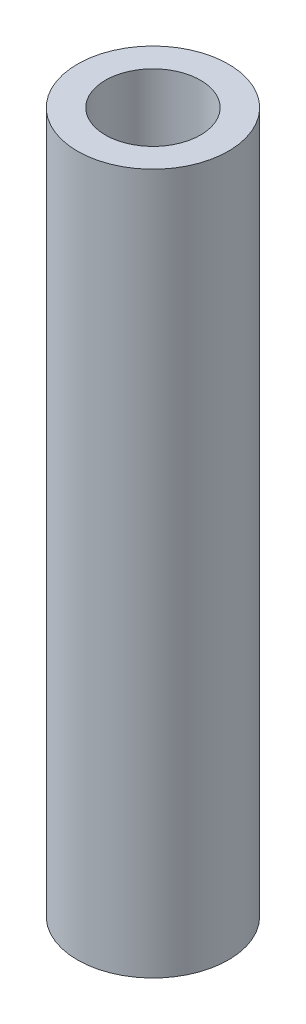
ISO-10303-21;
HEADER;
FILE_DESCRIPTION(('STEP AP214'),'2;1');
FILE_NAME('part.step','',(''),(''),'','','');
FILE_SCHEMA(('AUTOMOTIVE_DESIGN { 1 0 10303 214 1 1 1 1 }'));
ENDSEC;
DATA;
#1=APPLICATION_CONTEXT('core data for automotive mechanical design processes');
#2=APPLICATION_PROTOCOL_DEFINITION('international standard','automotive_design',2000,#1);
#3=PRODUCT_CONTEXT('',#1,'mechanical');
#4=PRODUCT('Part','Part','',(#3));
#5=PRODUCT_RELATED_PRODUCT_CATEGORY('part','',(#4));
#6=PRODUCT_DEFINITION_FORMATION('','',#4);
#7=PRODUCT_DEFINITION_CONTEXT('part definition',#1,'design');
#8=PRODUCT_DEFINITION('design','',#6,#7);
#9=PRODUCT_DEFINITION_SHAPE('','',#8);
#10=(LENGTH_UNIT() NAMED_UNIT(*) SI_UNIT(.MILLI.,.METRE.));
#11=(NAMED_UNIT(*) PLANE_ANGLE_UNIT() SI_UNIT($,.RADIAN.));
#12=(NAMED_UNIT(*) SI_UNIT($,.STERADIAN.) SOLID_ANGLE_UNIT());
#13=UNCERTAINTY_MEASURE_WITH_UNIT(LENGTH_MEASURE(1.E-05),#10,'distance_accuracy_value','');
#14=(GEOMETRIC_REPRESENTATION_CONTEXT(3) GLOBAL_UNCERTAINTY_ASSIGNED_CONTEXT((#13)) GLOBAL_UNIT_ASSIGNED_CONTEXT((#10,
#11,#12)) REPRESENTATION_CONTEXT('',''));
#15=CARTESIAN_POINT('',(0.,0.,0.));
#16=DIRECTION('',(0.,0.,1.));
#17=DIRECTION('',(1.,0.,0.));
#18=AXIS2_PLACEMENT_3D('',#15,#16,#17);
#19=CARTESIAN_POINT('',(0.,-29.464,0.));
#20=DIRECTION('',(0.,1.,0.));
#21=DIRECTION('',(0.,0.,1.));
#22=AXIS2_PLACEMENT_3D('',#19,#20,#21);
#23=CYLINDRICAL_SURFACE('',#22,3.175);
#24=CARTESIAN_POINT('',(0.,-29.464,0.));
#25=DIRECTION('',(0.,1.,0.));
#26=DIRECTION('',(0.,0.,1.));
#27=AXIS2_PLACEMENT_3D('',#24,#25,#26);
#28=CIRCLE('',#27,3.175);
#29=CARTESIAN_POINT('',(0.,-29.464,3.175));
#30=VERTEX_POINT('',#29);
#31=EDGE_CURVE('E10',#30,#30,#28,.T.);
#32=ORIENTED_EDGE('',*,*,#31,.T.);
#33=EDGE_LOOP('',(#32));
#34=FACE_BOUND('',#33,.T.);
#35=CARTESIAN_POINT('',(0.,0.,0.));
#36=DIRECTION('',(0.,1.,0.));
#37=DIRECTION('',(0.,0.,1.));
#38=AXIS2_PLACEMENT_3D('',#35,#36,#37);
#39=CIRCLE('',#38,3.175);
#40=CARTESIAN_POINT('',(0.,0.,3.175));
#41=VERTEX_POINT('',#40);
#42=EDGE_CURVE('E42',#41,#41,#39,.T.);
#43=ORIENTED_EDGE('',*,*,#42,.F.);
#44=EDGE_LOOP('',(#43));
#45=FACE_BOUND('',#44,.T.);
#46=ADVANCED_FACE('F39',(#34,#45),#23,.T.);
#47=CARTESIAN_POINT('',(0.,-29.464,0.));
#48=DIRECTION('',(0.,1.,0.));
#49=DIRECTION('',(0.,0.,1.));
#50=AXIS2_PLACEMENT_3D('',#47,#48,#49);
#51=PLANE('',#50);
#52=CARTESIAN_POINT('',(0.,-29.464,0.));
#53=DIRECTION('',(0.,1.,0.));
#54=DIRECTION('',(0.,0.,1.));
#55=AXIS2_PLACEMENT_3D('',#52,#53,#54);
#56=CIRCLE('',#55,2.);
#57=CARTESIAN_POINT('',(0.,-29.464,2.));
#58=VERTEX_POINT('',#57);
#59=EDGE_CURVE('E49',#58,#58,#56,.T.);
#60=ORIENTED_EDGE('',*,*,#59,.T.);
#61=EDGE_LOOP('',(#60));
#62=FACE_BOUND('',#61,.T.);
#63=ORIENTED_EDGE('',*,*,#31,.F.);
#64=EDGE_LOOP('',(#63));
#65=FACE_BOUND('',#64,.T.);
#66=ADVANCED_FACE('F57',(#62,#65),#51,.F.);
#67=CARTESIAN_POINT('',(0.,0.,0.));
#68=DIRECTION('',(0.,1.,0.));
#69=DIRECTION('',(0.,0.,1.));
#70=AXIS2_PLACEMENT_3D('',#67,#68,#69);
#71=PLANE('',#70);
#72=CARTESIAN_POINT('',(0.,0.,0.));
#73=DIRECTION('',(0.,1.,0.));
#74=DIRECTION('',(0.,0.,1.));
#75=AXIS2_PLACEMENT_3D('',#72,#73,#74);
#76=CIRCLE('',#75,2.);
#77=CARTESIAN_POINT('',(0.,0.,2.));
#78=VERTEX_POINT('',#77);
#79=EDGE_CURVE('E51',#78,#78,#76,.T.);
#80=ORIENTED_EDGE('',*,*,#79,.F.);
#81=EDGE_LOOP('',(#80));
#82=FACE_BOUND('',#81,.T.);
#83=ORIENTED_EDGE('',*,*,#42,.T.);
#84=EDGE_LOOP('',(#83));
#85=FACE_BOUND('',#84,.T.);
#86=ADVANCED_FACE('F63',(#82,#85),#71,.T.);
#87=CARTESIAN_POINT('',(0.,-29.464,0.));
#88=DIRECTION('',(0.,1.,0.));
#89=DIRECTION('',(0.,0.,1.));
#90=AXIS2_PLACEMENT_3D('',#87,#88,#89);
#91=CYLINDRICAL_SURFACE('',#90,2.);
#92=ORIENTED_EDGE('',*,*,#59,.F.);
#93=EDGE_LOOP('',(#92));
#94=FACE_BOUND('',#93,.T.);
#95=ORIENTED_EDGE('',*,*,#79,.T.);
#96=EDGE_LOOP('',(#95));
#97=FACE_BOUND('',#96,.T.);
#98=ADVANCED_FACE('F60',(#94,#97),#91,.F.);
#99=CLOSED_SHELL('',(#46,#66,#86,#98));
#100=MANIFOLD_SOLID_BREP('B2',#99);
#101=ADVANCED_BREP_SHAPE_REPRESENTATION('',(#18,#100),#14);
#102=SHAPE_DEFINITION_REPRESENTATION(#9,#101);
ENDSEC;
END-ISO-10303-21;
